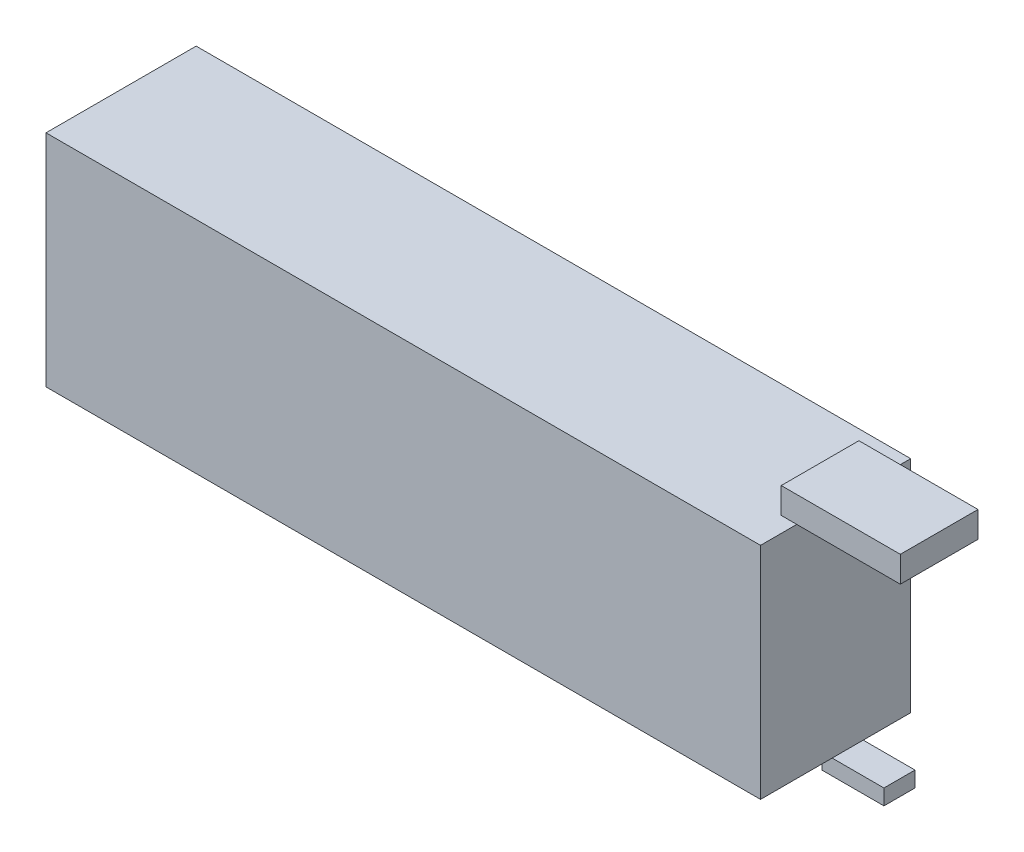
ISO-10303-21;
HEADER;
FILE_DESCRIPTION(('STEP AP214'),'2;1');
FILE_NAME('part.step','',(''),(''),'','','');
FILE_SCHEMA(('AUTOMOTIVE_DESIGN { 1 0 10303 214 1 1 1 1 }'));
ENDSEC;
DATA;
#1=APPLICATION_CONTEXT('core data for automotive mechanical design processes');
#2=APPLICATION_PROTOCOL_DEFINITION('international standard','automotive_design',2000,#1);
#3=PRODUCT_CONTEXT('',#1,'mechanical');
#4=PRODUCT('Part','Part','',(#3));
#5=PRODUCT_RELATED_PRODUCT_CATEGORY('part','',(#4));
#6=PRODUCT_DEFINITION_FORMATION('','',#4);
#7=PRODUCT_DEFINITION_CONTEXT('part definition',#1,'design');
#8=PRODUCT_DEFINITION('design','',#6,#7);
#9=PRODUCT_DEFINITION_SHAPE('','',#8);
#10=(LENGTH_UNIT() NAMED_UNIT(*) SI_UNIT(.MILLI.,.METRE.));
#11=(NAMED_UNIT(*) PLANE_ANGLE_UNIT() SI_UNIT($,.RADIAN.));
#12=(NAMED_UNIT(*) SI_UNIT($,.STERADIAN.) SOLID_ANGLE_UNIT());
#13=UNCERTAINTY_MEASURE_WITH_UNIT(LENGTH_MEASURE(1.E-05),#10,'distance_accuracy_value','');
#14=(GEOMETRIC_REPRESENTATION_CONTEXT(3) GLOBAL_UNCERTAINTY_ASSIGNED_CONTEXT((#13)) GLOBAL_UNIT_ASSIGNED_CONTEXT((#10,
#11,#12)) REPRESENTATION_CONTEXT('',''));
#15=CARTESIAN_POINT('',(0.,0.,0.));
#16=DIRECTION('',(0.,0.,1.));
#17=DIRECTION('',(1.,0.,0.));
#18=AXIS2_PLACEMENT_3D('',#15,#16,#17);
#19=CARTESIAN_POINT('',(69.0000000000002,21.25,14.5));
#20=DIRECTION('',(-1.,0.,0.));
#21=DIRECTION('',(0.,0.,1.));
#22=AXIS2_PLACEMENT_3D('',#19,#20,#21);
#23=PLANE('',#22);
#24=DIRECTION('',(0.,1.,0.));
#25=VECTOR('',#24,1.);
#26=CARTESIAN_POINT('',(69.0000000000002,21.25,-14.5));
#27=LINE('',#26,#25);
#28=CARTESIAN_POINT('',(69.0000000000002,-21.2500000000001,-14.5));
#29=VERTEX_POINT('',#28);
#30=CARTESIAN_POINT('',(69.0000000000002,21.25,-14.5));
#31=VERTEX_POINT('',#30);
#32=EDGE_CURVE('E221',#29,#31,#27,.T.);
#33=ORIENTED_EDGE('',*,*,#32,.T.);
#34=DIRECTION('',(0.,0.,-1.));
#35=VECTOR('',#34,1.);
#36=CARTESIAN_POINT('',(69.0000000000002,21.25,14.5));
#37=LINE('',#36,#35);
#38=CARTESIAN_POINT('',(69.0000000000002,21.25,-7.5));
#39=VERTEX_POINT('',#38);
#40=EDGE_CURVE('E52',#39,#31,#37,.T.);
#41=ORIENTED_EDGE('',*,*,#40,.F.);
#42=CARTESIAN_POINT('',(69.0000000000002,21.25,7.5));
#43=VERTEX_POINT('',#42);
#44=EDGE_CURVE('E55',#43,#39,#37,.T.);
#45=ORIENTED_EDGE('',*,*,#44,.F.);
#46=CARTESIAN_POINT('',(69.0000000000002,21.25,14.5));
#47=VERTEX_POINT('',#46);
#48=EDGE_CURVE('E11',#47,#43,#37,.T.);
#49=ORIENTED_EDGE('',*,*,#48,.F.);
#50=DIRECTION('',(0.,1.,0.));
#51=VECTOR('',#50,1.);
#52=CARTESIAN_POINT('',(69.0000000000002,21.25,14.5));
#53=LINE('',#52,#51);
#54=CARTESIAN_POINT('',(69.0000000000002,-21.2500000000001,14.5));
#55=VERTEX_POINT('',#54);
#56=EDGE_CURVE('E223',#55,#47,#53,.T.);
#57=ORIENTED_EDGE('',*,*,#56,.F.);
#58=DIRECTION('',(0.,0.,-1.));
#59=VECTOR('',#58,1.);
#60=CARTESIAN_POINT('',(69.0000000000002,-21.2500000000001,14.5));
#61=LINE('',#60,#59);
#62=CARTESIAN_POINT('',(69.0000000000002,-21.2500000000001,0.665854832775248));
#63=VERTEX_POINT('',#62);
#64=EDGE_CURVE('E245',#55,#63,#61,.T.);
#65=ORIENTED_EDGE('',*,*,#64,.T.);
#66=CARTESIAN_POINT('',(69.0000000000002,-21.2500000000001,-5.33414516722474));
#67=VERTEX_POINT('',#66);
#68=EDGE_CURVE('E248',#63,#67,#61,.T.);
#69=ORIENTED_EDGE('',*,*,#68,.T.);
#70=EDGE_CURVE('E68',#67,#29,#61,.T.);
#71=ORIENTED_EDGE('',*,*,#70,.T.);
#72=EDGE_LOOP('',(#33,#41,#45,#49,#57,#65,#69,#71));
#73=FACE_BOUND('',#72,.T.);
#74=ADVANCED_FACE('F44',(#73),#23,.F.);
#75=CARTESIAN_POINT('',(-68.9999999999997,21.2499999999998,14.5));
#76=DIRECTION('',(0.,-1.,0.));
#77=DIRECTION('',(1.,0.,0.));
#78=AXIS2_PLACEMENT_3D('',#75,#76,#77);
#79=PLANE('',#78);
#80=DIRECTION('',(0.,0.,-1.));
#81=VECTOR('',#80,1.);
#82=CARTESIAN_POINT('',(66.0000000000002,21.25,14.5));
#83=LINE('',#82,#81);
#84=CARTESIAN_POINT('',(66.0000000000002,21.25,7.5));
#85=VERTEX_POINT('',#84);
#86=CARTESIAN_POINT('',(66.0000000000002,21.25,-7.5));
#87=VERTEX_POINT('',#86);
#88=EDGE_CURVE('E207',#85,#87,#83,.T.);
#89=ORIENTED_EDGE('',*,*,#88,.T.);
#90=DIRECTION('',(1.,0.,0.));
#91=VECTOR('',#90,1.);
#92=CARTESIAN_POINT('',(66.0000000000002,21.25,-7.5));
#93=LINE('',#92,#91);
#94=EDGE_CURVE('E220',#87,#39,#93,.T.);
#95=ORIENTED_EDGE('',*,*,#94,.T.);
#96=ORIENTED_EDGE('',*,*,#40,.T.);
#97=DIRECTION('',(-1.,0.,0.));
#98=VECTOR('',#97,1.);
#99=CARTESIAN_POINT('',(-68.9999999999997,21.2499999999998,-14.5));
#100=LINE('',#99,#98);
#101=CARTESIAN_POINT('',(-68.9999999999997,21.2499999999998,-14.5));
#102=VERTEX_POINT('',#101);
#103=EDGE_CURVE('E240',#31,#102,#100,.T.);
#104=ORIENTED_EDGE('',*,*,#103,.T.);
#105=DIRECTION('',(0.,0.,-1.));
#106=VECTOR('',#105,1.);
#107=CARTESIAN_POINT('',(-68.9999999999997,21.2499999999998,14.5));
#108=LINE('',#107,#106);
#109=CARTESIAN_POINT('',(-68.9999999999997,21.2499999999998,14.5));
#110=VERTEX_POINT('',#109);
#111=EDGE_CURVE('E247',#110,#102,#108,.T.);
#112=ORIENTED_EDGE('',*,*,#111,.F.);
#113=DIRECTION('',(-1.,0.,0.));
#114=VECTOR('',#113,1.);
#115=CARTESIAN_POINT('',(-68.9999999999997,21.2499999999998,14.5));
#116=LINE('',#115,#114);
#117=EDGE_CURVE('E229',#47,#110,#116,.T.);
#118=ORIENTED_EDGE('',*,*,#117,.F.);
#119=ORIENTED_EDGE('',*,*,#48,.T.);
#120=DIRECTION('',(1.,0.,0.));
#121=VECTOR('',#120,1.);
#122=CARTESIAN_POINT('',(66.0000000000002,21.25,7.5));
#123=LINE('',#122,#121);
#124=EDGE_CURVE('E213',#85,#43,#123,.T.);
#125=ORIENTED_EDGE('',*,*,#124,.F.);
#126=EDGE_LOOP('',(#89,#95,#96,#104,#112,#118,#119,#125));
#127=FACE_BOUND('',#126,.T.);
#128=ADVANCED_FACE('F268',(#127),#79,.F.);
#129=CARTESIAN_POINT('',(-68.9999999999997,21.2499999999998,14.5));
#130=DIRECTION('',(1.,0.,0.));
#131=DIRECTION('',(0.,1.,0.));
#132=AXIS2_PLACEMENT_3D('',#129,#130,#131);
#133=PLANE('',#132);
#134=DIRECTION('',(0.,-1.,0.));
#135=VECTOR('',#134,1.);
#136=CARTESIAN_POINT('',(-68.9999999999997,21.2499999999998,-14.5));
#137=LINE('',#136,#135);
#138=CARTESIAN_POINT('',(-68.9999999999999,-21.2500000000001,-14.5));
#139=VERTEX_POINT('',#138);
#140=EDGE_CURVE('E239',#102,#139,#137,.T.);
#141=ORIENTED_EDGE('',*,*,#140,.T.);
#142=DIRECTION('',(0.,0.,-1.));
#143=VECTOR('',#142,1.);
#144=CARTESIAN_POINT('',(-68.9999999999999,-21.2500000000001,14.5));
#145=LINE('',#144,#143);
#146=CARTESIAN_POINT('',(-68.9999999999999,-21.2500000000001,14.5));
#147=VERTEX_POINT('',#146);
#148=EDGE_CURVE('E243',#147,#139,#145,.T.);
#149=ORIENTED_EDGE('',*,*,#148,.F.);
#150=DIRECTION('',(0.,-1.,0.));
#151=VECTOR('',#150,1.);
#152=CARTESIAN_POINT('',(-68.9999999999997,21.2499999999998,14.5));
#153=LINE('',#152,#151);
#154=EDGE_CURVE('E233',#110,#147,#153,.T.);
#155=ORIENTED_EDGE('',*,*,#154,.F.);
#156=ORIENTED_EDGE('',*,*,#111,.T.);
#157=EDGE_LOOP('',(#141,#149,#155,#156));
#158=FACE_BOUND('',#157,.T.);
#159=ADVANCED_FACE('F277',(#158),#133,.F.);
#160=CARTESIAN_POINT('',(-68.9999999999999,-21.2500000000001,14.5));
#161=DIRECTION('',(0.,1.,0.));
#162=DIRECTION('',(-1.,0.,0.));
#163=AXIS2_PLACEMENT_3D('',#160,#161,#162);
#164=PLANE('',#163);
#165=DIRECTION('',(0.,0.,-1.));
#166=VECTOR('',#165,1.);
#167=CARTESIAN_POINT('',(67.0000000000002,-21.2500000000002,14.5));
#168=LINE('',#167,#166);
#169=CARTESIAN_POINT('',(67.0000000000002,-21.2500000000002,0.665854832775245));
#170=VERTEX_POINT('',#169);
#171=CARTESIAN_POINT('',(67.0000000000002,-21.2500000000002,-5.33414516722475));
#172=VERTEX_POINT('',#171);
#173=EDGE_CURVE('E58',#170,#172,#168,.T.);
#174=ORIENTED_EDGE('',*,*,#173,.F.);
#175=DIRECTION('',(1.,0.,0.));
#176=VECTOR('',#175,1.);
#177=CARTESIAN_POINT('',(67.0000000000002,-21.2500000000002,0.665854832775245));
#178=LINE('',#177,#176);
#179=EDGE_CURVE('E182',#170,#63,#178,.T.);
#180=ORIENTED_EDGE('',*,*,#179,.T.);
#181=ORIENTED_EDGE('',*,*,#64,.F.);
#182=DIRECTION('',(1.,0.,0.));
#183=VECTOR('',#182,1.);
#184=CARTESIAN_POINT('',(-68.9999999999999,-21.2500000000001,14.5));
#185=LINE('',#184,#183);
#186=EDGE_CURVE('E232',#147,#55,#185,.T.);
#187=ORIENTED_EDGE('',*,*,#186,.F.);
#188=ORIENTED_EDGE('',*,*,#148,.T.);
#189=DIRECTION('',(1.,0.,0.));
#190=VECTOR('',#189,1.);
#191=CARTESIAN_POINT('',(-68.9999999999999,-21.2500000000001,-14.5));
#192=LINE('',#191,#190);
#193=EDGE_CURVE('E226',#139,#29,#192,.T.);
#194=ORIENTED_EDGE('',*,*,#193,.T.);
#195=ORIENTED_EDGE('',*,*,#70,.F.);
#196=DIRECTION('',(1.,0.,0.));
#197=VECTOR('',#196,1.);
#198=CARTESIAN_POINT('',(67.0000000000002,-21.2500000000002,-5.33414516722475));
#199=LINE('',#198,#197);
#200=EDGE_CURVE('E183',#172,#67,#199,.T.);
#201=ORIENTED_EDGE('',*,*,#200,.F.);
#202=EDGE_LOOP('',(#174,#180,#181,#187,#188,#194,#195,#201));
#203=FACE_BOUND('',#202,.T.);
#204=ADVANCED_FACE('F311',(#203),#164,.F.);
#205=CARTESIAN_POINT('',(0.,0.,14.5));
#206=DIRECTION('',(0.,0.,1.));
#207=DIRECTION('',(1.,0.,0.));
#208=AXIS2_PLACEMENT_3D('',#205,#206,#207);
#209=PLANE('',#208);
#210=ORIENTED_EDGE('',*,*,#56,.T.);
#211=ORIENTED_EDGE('',*,*,#117,.T.);
#212=ORIENTED_EDGE('',*,*,#154,.T.);
#213=ORIENTED_EDGE('',*,*,#186,.T.);
#214=EDGE_LOOP('',(#210,#211,#212,#213));
#215=FACE_BOUND('',#214,.T.);
#216=ADVANCED_FACE('F276',(#215),#209,.T.);
#217=CARTESIAN_POINT('',(0.,0.,-14.5));
#218=DIRECTION('',(0.,0.,1.));
#219=DIRECTION('',(1.,0.,0.));
#220=AXIS2_PLACEMENT_3D('',#217,#218,#219);
#221=PLANE('',#220);
#222=ORIENTED_EDGE('',*,*,#32,.F.);
#223=ORIENTED_EDGE('',*,*,#193,.F.);
#224=ORIENTED_EDGE('',*,*,#140,.F.);
#225=ORIENTED_EDGE('',*,*,#103,.F.);
#226=EDGE_LOOP('',(#222,#223,#224,#225));
#227=FACE_BOUND('',#226,.T.);
#228=ADVANCED_FACE('F273',(#227),#221,.F.);
#229=CARTESIAN_POINT('',(66.0000000000002,21.25,7.5));
#230=DIRECTION('',(0.,0.,-1.));
#231=DIRECTION('',(-1.,0.,0.));
#232=AXIS2_PLACEMENT_3D('',#229,#230,#231);
#233=PLANE('',#232);
#234=ORIENTED_EDGE('',*,*,#124,.T.);
#235=CARTESIAN_POINT('',(89.0000000000002,21.25,7.5));
#236=VERTEX_POINT('',#235);
#237=EDGE_CURVE('E215',#43,#236,#123,.T.);
#238=ORIENTED_EDGE('',*,*,#237,.T.);
#239=DIRECTION('',(0.,1.,0.));
#240=VECTOR('',#239,1.);
#241=CARTESIAN_POINT('',(89.0000000000002,21.25,7.5));
#242=LINE('',#241,#240);
#243=CARTESIAN_POINT('',(89.0000000000002,26.25,7.5));
#244=VERTEX_POINT('',#243);
#245=EDGE_CURVE('E181',#236,#244,#242,.T.);
#246=ORIENTED_EDGE('',*,*,#245,.T.);
#247=DIRECTION('',(1.,0.,0.));
#248=VECTOR('',#247,1.);
#249=CARTESIAN_POINT('',(66.0000000000002,26.25,7.5));
#250=LINE('',#249,#248);
#251=CARTESIAN_POINT('',(66.0000000000002,26.25,7.5));
#252=VERTEX_POINT('',#251);
#253=EDGE_CURVE('E225',#252,#244,#250,.T.);
#254=ORIENTED_EDGE('',*,*,#253,.F.);
#255=DIRECTION('',(0.,1.,0.));
#256=VECTOR('',#255,1.);
#257=CARTESIAN_POINT('',(66.0000000000002,21.25,7.5));
#258=LINE('',#257,#256);
#259=EDGE_CURVE('E203',#85,#252,#258,.T.);
#260=ORIENTED_EDGE('',*,*,#259,.F.);
#261=EDGE_LOOP('',(#234,#238,#246,#254,#260));
#262=FACE_BOUND('',#261,.T.);
#263=ADVANCED_FACE('F284',(#262),#233,.F.);
#264=CARTESIAN_POINT('',(66.0000000000002,26.25,14.5));
#265=DIRECTION('',(0.,-1.,0.));
#266=DIRECTION('',(0.,0.,-1.));
#267=AXIS2_PLACEMENT_3D('',#264,#265,#266);
#268=PLANE('',#267);
#269=ORIENTED_EDGE('',*,*,#253,.T.);
#270=DIRECTION('',(0.,0.,-1.));
#271=VECTOR('',#270,1.);
#272=CARTESIAN_POINT('',(89.0000000000002,26.25,14.5));
#273=LINE('',#272,#271);
#274=CARTESIAN_POINT('',(89.0000000000002,26.25,-7.5));
#275=VERTEX_POINT('',#274);
#276=EDGE_CURVE('E194',#244,#275,#273,.T.);
#277=ORIENTED_EDGE('',*,*,#276,.T.);
#278=DIRECTION('',(1.,0.,0.));
#279=VECTOR('',#278,1.);
#280=CARTESIAN_POINT('',(66.0000000000002,26.25,-7.5));
#281=LINE('',#280,#279);
#282=CARTESIAN_POINT('',(66.0000000000002,26.25,-7.5));
#283=VERTEX_POINT('',#282);
#284=EDGE_CURVE('E219',#283,#275,#281,.T.);
#285=ORIENTED_EDGE('',*,*,#284,.F.);
#286=DIRECTION('',(0.,0.,-1.));
#287=VECTOR('',#286,1.);
#288=CARTESIAN_POINT('',(66.0000000000002,26.25,14.5));
#289=LINE('',#288,#287);
#290=EDGE_CURVE('E204',#252,#283,#289,.T.);
#291=ORIENTED_EDGE('',*,*,#290,.F.);
#292=EDGE_LOOP('',(#269,#277,#285,#291));
#293=FACE_BOUND('',#292,.T.);
#294=ADVANCED_FACE('F291',(#293),#268,.F.);
#295=CARTESIAN_POINT('',(66.0000000000002,21.25,-7.5));
#296=DIRECTION('',(0.,0.,-1.));
#297=DIRECTION('',(-1.,0.,0.));
#298=AXIS2_PLACEMENT_3D('',#295,#296,#297);
#299=PLANE('',#298);
#300=ORIENTED_EDGE('',*,*,#284,.T.);
#301=DIRECTION('',(0.,1.,0.));
#302=VECTOR('',#301,1.);
#303=CARTESIAN_POINT('',(89.0000000000002,21.25,-7.5));
#304=LINE('',#303,#302);
#305=CARTESIAN_POINT('',(89.0000000000002,21.25,-7.5));
#306=VERTEX_POINT('',#305);
#307=EDGE_CURVE('E191',#306,#275,#304,.T.);
#308=ORIENTED_EDGE('',*,*,#307,.F.);
#309=EDGE_CURVE('E216',#39,#306,#93,.T.);
#310=ORIENTED_EDGE('',*,*,#309,.F.);
#311=ORIENTED_EDGE('',*,*,#94,.F.);
#312=DIRECTION('',(0.,1.,0.));
#313=VECTOR('',#312,1.);
#314=CARTESIAN_POINT('',(66.0000000000002,21.25,-7.5));
#315=LINE('',#314,#313);
#316=EDGE_CURVE('E206',#87,#283,#315,.T.);
#317=ORIENTED_EDGE('',*,*,#316,.T.);
#318=EDGE_LOOP('',(#300,#308,#310,#311,#317));
#319=FACE_BOUND('',#318,.T.);
#320=ADVANCED_FACE('F270',(#319),#299,.T.);
#321=CARTESIAN_POINT('',(66.0000000000002,21.25,14.5));
#322=DIRECTION('',(0.,-1.,0.));
#323=DIRECTION('',(0.,0.,-1.));
#324=AXIS2_PLACEMENT_3D('',#321,#322,#323);
#325=PLANE('',#324);
#326=ORIENTED_EDGE('',*,*,#237,.F.);
#327=ORIENTED_EDGE('',*,*,#44,.T.);
#328=ORIENTED_EDGE('',*,*,#309,.T.);
#329=DIRECTION('',(0.,0.,-1.));
#330=VECTOR('',#329,1.);
#331=CARTESIAN_POINT('',(89.0000000000002,21.25,14.5));
#332=LINE('',#331,#330);
#333=EDGE_CURVE('E196',#236,#306,#332,.T.);
#334=ORIENTED_EDGE('',*,*,#333,.F.);
#335=EDGE_LOOP('',(#326,#327,#328,#334));
#336=FACE_BOUND('',#335,.T.);
#337=ADVANCED_FACE('F257',(#336),#325,.T.);
#338=CARTESIAN_POINT('',(66.0000000000002,0.,0.));
#339=DIRECTION('',(-1.,0.,0.));
#340=DIRECTION('',(0.,0.,1.));
#341=AXIS2_PLACEMENT_3D('',#338,#339,#340);
#342=PLANE('',#341);
#343=ORIENTED_EDGE('',*,*,#259,.T.);
#344=ORIENTED_EDGE('',*,*,#290,.T.);
#345=ORIENTED_EDGE('',*,*,#316,.F.);
#346=ORIENTED_EDGE('',*,*,#88,.F.);
#347=EDGE_LOOP('',(#343,#344,#345,#346));
#348=FACE_BOUND('',#347,.T.);
#349=ADVANCED_FACE('F288',(#348),#342,.T.);
#350=CARTESIAN_POINT('',(89.0000000000002,0.,0.));
#351=DIRECTION('',(-1.,0.,0.));
#352=DIRECTION('',(0.,0.,1.));
#353=AXIS2_PLACEMENT_3D('',#350,#351,#352);
#354=PLANE('',#353);
#355=ORIENTED_EDGE('',*,*,#245,.F.);
#356=ORIENTED_EDGE('',*,*,#333,.T.);
#357=ORIENTED_EDGE('',*,*,#307,.T.);
#358=ORIENTED_EDGE('',*,*,#276,.F.);
#359=EDGE_LOOP('',(#355,#356,#357,#358));
#360=FACE_BOUND('',#359,.T.);
#361=ADVANCED_FACE('F295',(#360),#354,.F.);
#362=CARTESIAN_POINT('',(67.0000000000002,21.25,0.665854832775247));
#363=DIRECTION('',(0.,0.,1.));
#364=DIRECTION('',(0.,-1.,0.));
#365=AXIS2_PLACEMENT_3D('',#362,#363,#364);
#366=PLANE('',#365);
#367=DIRECTION('',(1.,0.,0.));
#368=VECTOR('',#367,1.);
#369=CARTESIAN_POINT('',(67.0000000000002,-24.2500000000001,0.665854832775245));
#370=LINE('',#369,#368);
#371=CARTESIAN_POINT('',(67.0000000000002,-24.2500000000001,0.665854832775245));
#372=VERTEX_POINT('',#371);
#373=CARTESIAN_POINT('',(79.0000000000002,-24.2500000000001,0.665854832775245));
#374=VERTEX_POINT('',#373);
#375=EDGE_CURVE('E144',#372,#374,#370,.T.);
#376=ORIENTED_EDGE('',*,*,#375,.T.);
#377=DIRECTION('',(0.,-1.,0.));
#378=VECTOR('',#377,1.);
#379=CARTESIAN_POINT('',(79.0000000000002,21.25,0.665854832775247));
#380=LINE('',#379,#378);
#381=CARTESIAN_POINT('',(79.0000000000002,-21.2500000000002,0.665854832775245));
#382=VERTEX_POINT('',#381);
#383=EDGE_CURVE('E147',#382,#374,#380,.T.);
#384=ORIENTED_EDGE('',*,*,#383,.F.);
#385=EDGE_CURVE('E184',#63,#382,#178,.T.);
#386=ORIENTED_EDGE('',*,*,#385,.F.);
#387=ORIENTED_EDGE('',*,*,#179,.F.);
#388=DIRECTION('',(0.,-1.,0.));
#389=VECTOR('',#388,1.);
#390=CARTESIAN_POINT('',(67.0000000000002,21.25,0.665854832775247));
#391=LINE('',#390,#389);
#392=EDGE_CURVE('E153',#170,#372,#391,.T.);
#393=ORIENTED_EDGE('',*,*,#392,.T.);
#394=EDGE_LOOP('',(#376,#384,#386,#387,#393));
#395=FACE_BOUND('',#394,.T.);
#396=ADVANCED_FACE('F150',(#395),#366,.T.);
#397=CARTESIAN_POINT('',(67.0000000000002,-21.2500000000002,14.5));
#398=DIRECTION('',(0.,-1.,0.));
#399=DIRECTION('',(0.,0.,-1.));
#400=AXIS2_PLACEMENT_3D('',#397,#398,#399);
#401=PLANE('',#400);
#402=ORIENTED_EDGE('',*,*,#68,.F.);
#403=ORIENTED_EDGE('',*,*,#385,.T.);
#404=DIRECTION('',(0.,0.,-1.));
#405=VECTOR('',#404,1.);
#406=CARTESIAN_POINT('',(79.0000000000002,-21.2500000000002,14.5));
#407=LINE('',#406,#405);
#408=CARTESIAN_POINT('',(79.0000000000002,-21.2500000000002,-5.33414516722475));
#409=VERTEX_POINT('',#408);
#410=EDGE_CURVE('E168',#382,#409,#407,.T.);
#411=ORIENTED_EDGE('',*,*,#410,.T.);
#412=EDGE_CURVE('E189',#67,#409,#199,.T.);
#413=ORIENTED_EDGE('',*,*,#412,.F.);
#414=EDGE_LOOP('',(#402,#403,#411,#413));
#415=FACE_BOUND('',#414,.T.);
#416=ADVANCED_FACE('F392',(#415),#401,.F.);
#417=CARTESIAN_POINT('',(67.0000000000002,21.25,-5.33414516722475));
#418=DIRECTION('',(0.,0.,1.));
#419=DIRECTION('',(1.,0.,0.));
#420=AXIS2_PLACEMENT_3D('',#417,#418,#419);
#421=PLANE('',#420);
#422=ORIENTED_EDGE('',*,*,#200,.T.);
#423=ORIENTED_EDGE('',*,*,#412,.T.);
#424=DIRECTION('',(0.,-1.,0.));
#425=VECTOR('',#424,1.);
#426=CARTESIAN_POINT('',(79.0000000000002,21.25,-5.33414516722475));
#427=LINE('',#426,#425);
#428=CARTESIAN_POINT('',(79.0000000000002,-24.2500000000001,-5.33414516722475));
#429=VERTEX_POINT('',#428);
#430=EDGE_CURVE('E167',#409,#429,#427,.T.);
#431=ORIENTED_EDGE('',*,*,#430,.T.);
#432=DIRECTION('',(1.,0.,0.));
#433=VECTOR('',#432,1.);
#434=CARTESIAN_POINT('',(67.0000000000002,-24.2500000000001,-5.33414516722475));
#435=LINE('',#434,#433);
#436=CARTESIAN_POINT('',(67.0000000000002,-24.2500000000001,-5.33414516722475));
#437=VERTEX_POINT('',#436);
#438=EDGE_CURVE('E160',#437,#429,#435,.T.);
#439=ORIENTED_EDGE('',*,*,#438,.F.);
#440=DIRECTION('',(0.,-1.,0.));
#441=VECTOR('',#440,1.);
#442=CARTESIAN_POINT('',(67.0000000000002,21.25,-5.33414516722475));
#443=LINE('',#442,#441);
#444=EDGE_CURVE('E177',#172,#437,#443,.T.);
#445=ORIENTED_EDGE('',*,*,#444,.F.);
#446=EDGE_LOOP('',(#422,#423,#431,#439,#445));
#447=FACE_BOUND('',#446,.T.);
#448=ADVANCED_FACE('F405',(#447),#421,.F.);
#449=CARTESIAN_POINT('',(67.0000000000002,-24.2500000000001,14.5));
#450=DIRECTION('',(0.,-1.,0.));
#451=DIRECTION('',(0.,0.,-1.));
#452=AXIS2_PLACEMENT_3D('',#449,#450,#451);
#453=PLANE('',#452);
#454=ORIENTED_EDGE('',*,*,#438,.T.);
#455=DIRECTION('',(0.,0.,-1.));
#456=VECTOR('',#455,1.);
#457=CARTESIAN_POINT('',(79.0000000000002,-24.2500000000001,14.5));
#458=LINE('',#457,#456);
#459=EDGE_CURVE('E159',#374,#429,#458,.T.);
#460=ORIENTED_EDGE('',*,*,#459,.F.);
#461=ORIENTED_EDGE('',*,*,#375,.F.);
#462=DIRECTION('',(0.,0.,-1.));
#463=VECTOR('',#462,1.);
#464=CARTESIAN_POINT('',(67.0000000000002,-24.2500000000001,14.5));
#465=LINE('',#464,#463);
#466=EDGE_CURVE('E178',#372,#437,#465,.T.);
#467=ORIENTED_EDGE('',*,*,#466,.T.);
#468=EDGE_LOOP('',(#454,#460,#461,#467));
#469=FACE_BOUND('',#468,.T.);
#470=ADVANCED_FACE('F161',(#469),#453,.T.);
#471=CARTESIAN_POINT('',(67.0000000000002,0.,0.));
#472=DIRECTION('',(1.,0.,0.));
#473=DIRECTION('',(0.,0.,-1.));
#474=AXIS2_PLACEMENT_3D('',#471,#472,#473);
#475=PLANE('',#474);
#476=ORIENTED_EDGE('',*,*,#392,.F.);
#477=ORIENTED_EDGE('',*,*,#173,.T.);
#478=ORIENTED_EDGE('',*,*,#444,.T.);
#479=ORIENTED_EDGE('',*,*,#466,.F.);
#480=EDGE_LOOP('',(#476,#477,#478,#479));
#481=FACE_BOUND('',#480,.T.);
#482=ADVANCED_FACE('F422',(#481),#475,.F.);
#483=CARTESIAN_POINT('',(79.0000000000002,0.,0.));
#484=DIRECTION('',(1.,0.,0.));
#485=DIRECTION('',(0.,0.,-1.));
#486=AXIS2_PLACEMENT_3D('',#483,#484,#485);
#487=PLANE('',#486);
#488=ORIENTED_EDGE('',*,*,#383,.T.);
#489=ORIENTED_EDGE('',*,*,#459,.T.);
#490=ORIENTED_EDGE('',*,*,#430,.F.);
#491=ORIENTED_EDGE('',*,*,#410,.F.);
#492=EDGE_LOOP('',(#488,#489,#490,#491));
#493=FACE_BOUND('',#492,.T.);
#494=ADVANCED_FACE('F169',(#493),#487,.T.);
#495=CLOSED_SHELL('',(#74,#128,#159,#204,#216,#228,#263,#294,#320,#337,#349,#361,#396,#416,#448,
#470,#482,#494));
#496=MANIFOLD_SOLID_BREP('B2',#495);
#497=ADVANCED_BREP_SHAPE_REPRESENTATION('',(#18,#496),#14);
#498=SHAPE_DEFINITION_REPRESENTATION(#9,#497);
ENDSEC;
END-ISO-10303-21;
